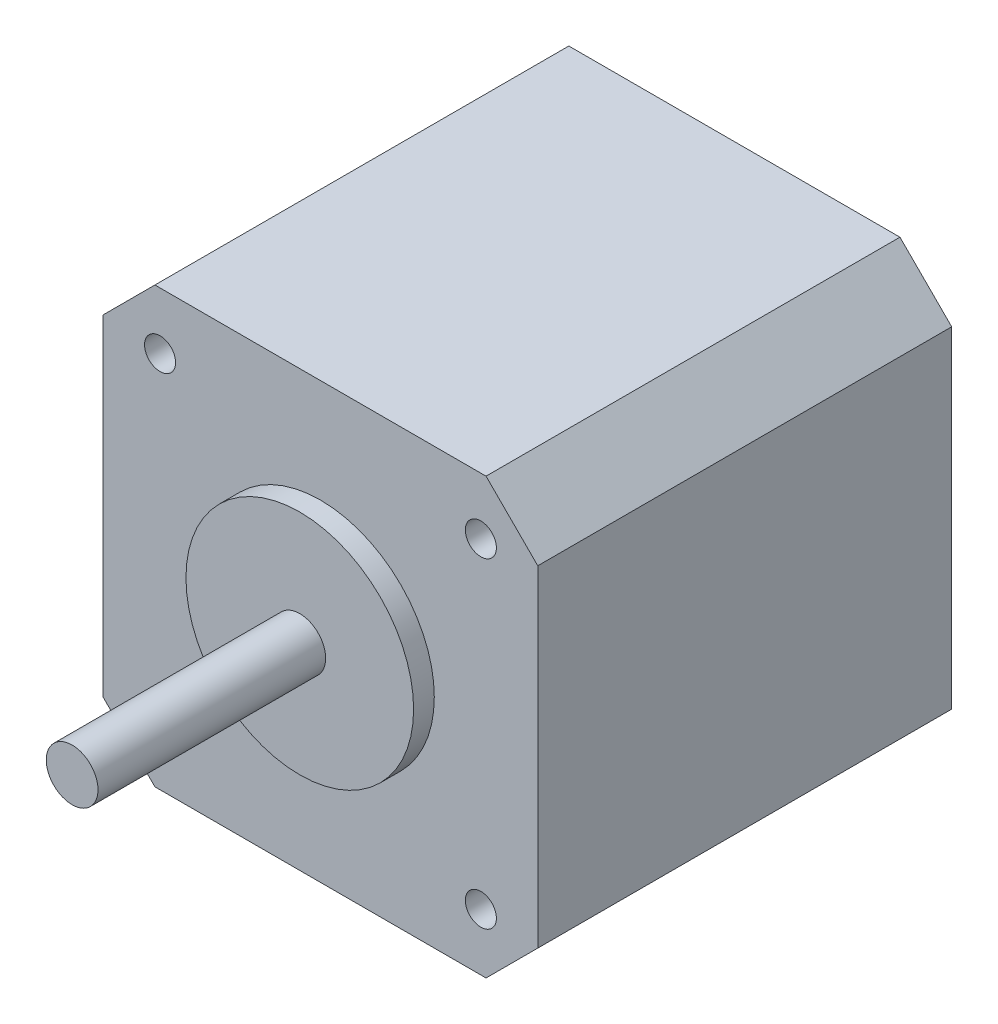
ISO-10303-21;
HEADER;
FILE_DESCRIPTION(('STEP AP214'),'2;1');
FILE_NAME('part.step','',(''),(''),'','','');
FILE_SCHEMA(('AUTOMOTIVE_DESIGN { 1 0 10303 214 1 1 1 1 }'));
ENDSEC;
DATA;
#1=APPLICATION_CONTEXT('core data for automotive mechanical design processes');
#2=APPLICATION_PROTOCOL_DEFINITION('international standard','automotive_design',2000,#1);
#3=PRODUCT_CONTEXT('',#1,'mechanical');
#4=PRODUCT('Part','Part','',(#3));
#5=PRODUCT_RELATED_PRODUCT_CATEGORY('part','',(#4));
#6=PRODUCT_DEFINITION_FORMATION('','',#4);
#7=PRODUCT_DEFINITION_CONTEXT('part definition',#1,'design');
#8=PRODUCT_DEFINITION('design','',#6,#7);
#9=PRODUCT_DEFINITION_SHAPE('','',#8);
#10=(LENGTH_UNIT() NAMED_UNIT(*) SI_UNIT(.MILLI.,.METRE.));
#11=(NAMED_UNIT(*) PLANE_ANGLE_UNIT() SI_UNIT($,.RADIAN.));
#12=(NAMED_UNIT(*) SI_UNIT($,.STERADIAN.) SOLID_ANGLE_UNIT());
#13=UNCERTAINTY_MEASURE_WITH_UNIT(LENGTH_MEASURE(1.E-05),#10,'distance_accuracy_value','');
#14=(GEOMETRIC_REPRESENTATION_CONTEXT(3) GLOBAL_UNCERTAINTY_ASSIGNED_CONTEXT((#13)) GLOBAL_UNIT_ASSIGNED_CONTEXT((#10,
#11,#12)) REPRESENTATION_CONTEXT('',''));
#15=CARTESIAN_POINT('',(0.,0.,0.));
#16=DIRECTION('',(0.,0.,1.));
#17=DIRECTION('',(1.,0.,0.));
#18=AXIS2_PLACEMENT_3D('',#15,#16,#17);
#19=CARTESIAN_POINT('',(21.,-21.,40.));
#20=DIRECTION('',(-1.,0.,0.));
#21=DIRECTION('',(0.,0.,1.));
#22=AXIS2_PLACEMENT_3D('',#19,#20,#21);
#23=PLANE('',#22);
#24=DIRECTION('',(0.,1.,0.));
#25=VECTOR('',#24,1.);
#26=CARTESIAN_POINT('',(21.,-21.,40.));
#27=LINE('',#26,#25);
#28=CARTESIAN_POINT('',(21.,-16.,40.));
#29=VERTEX_POINT('',#28);
#30=CARTESIAN_POINT('',(21.,16.,40.));
#31=VERTEX_POINT('',#30);
#32=EDGE_CURVE('E124',#29,#31,#27,.T.);
#33=ORIENTED_EDGE('',*,*,#32,.F.);
#34=DIRECTION('',(0.,0.,-1.));
#35=VECTOR('',#34,1.);
#36=CARTESIAN_POINT('',(21.,-16.,40.));
#37=LINE('',#36,#35);
#38=CARTESIAN_POINT('',(21.,-16.,0.));
#39=VERTEX_POINT('',#38);
#40=EDGE_CURVE('E109',#29,#39,#37,.T.);
#41=ORIENTED_EDGE('',*,*,#40,.T.);
#42=DIRECTION('',(0.,1.,0.));
#43=VECTOR('',#42,1.);
#44=CARTESIAN_POINT('',(21.,-21.,0.));
#45=LINE('',#44,#43);
#46=CARTESIAN_POINT('',(21.,16.,0.));
#47=VERTEX_POINT('',#46);
#48=EDGE_CURVE('E121',#39,#47,#45,.T.);
#49=ORIENTED_EDGE('',*,*,#48,.T.);
#50=DIRECTION('',(0.,0.,1.));
#51=VECTOR('',#50,1.);
#52=CARTESIAN_POINT('',(21.,16.,40.));
#53=LINE('',#52,#51);
#54=EDGE_CURVE('E126',#47,#31,#53,.T.);
#55=ORIENTED_EDGE('',*,*,#54,.T.);
#56=EDGE_LOOP('',(#33,#41,#49,#55));
#57=FACE_BOUND('',#56,.T.);
#58=ADVANCED_FACE('F37',(#57),#23,.F.);
#59=CARTESIAN_POINT('',(-21.,21.,40.));
#60=DIRECTION('',(0.,-1.,0.));
#61=DIRECTION('',(0.,0.,-1.));
#62=AXIS2_PLACEMENT_3D('',#59,#60,#61);
#63=PLANE('',#62);
#64=DIRECTION('',(-1.,0.,0.));
#65=VECTOR('',#64,1.);
#66=CARTESIAN_POINT('',(-21.,21.,40.));
#67=LINE('',#66,#65);
#68=CARTESIAN_POINT('',(16.,21.,40.));
#69=VERTEX_POINT('',#68);
#70=CARTESIAN_POINT('',(-16.,21.,40.));
#71=VERTEX_POINT('',#70);
#72=EDGE_CURVE('E169',#69,#71,#67,.T.);
#73=ORIENTED_EDGE('',*,*,#72,.F.);
#74=DIRECTION('',(0.,0.,-1.));
#75=VECTOR('',#74,1.);
#76=CARTESIAN_POINT('',(16.,21.,40.));
#77=LINE('',#76,#75);
#78=CARTESIAN_POINT('',(16.,21.,0.));
#79=VERTEX_POINT('',#78);
#80=EDGE_CURVE('E11',#69,#79,#77,.T.);
#81=ORIENTED_EDGE('',*,*,#80,.T.);
#82=DIRECTION('',(-1.,0.,0.));
#83=VECTOR('',#82,1.);
#84=CARTESIAN_POINT('',(-21.,21.,0.));
#85=LINE('',#84,#83);
#86=CARTESIAN_POINT('',(-16.,21.,0.));
#87=VERTEX_POINT('',#86);
#88=EDGE_CURVE('E131',#79,#87,#85,.T.);
#89=ORIENTED_EDGE('',*,*,#88,.T.);
#90=DIRECTION('',(0.,0.,1.));
#91=VECTOR('',#90,1.);
#92=CARTESIAN_POINT('',(-16.,21.,40.));
#93=LINE('',#92,#91);
#94=EDGE_CURVE('E46',#87,#71,#93,.T.);
#95=ORIENTED_EDGE('',*,*,#94,.T.);
#96=EDGE_LOOP('',(#73,#81,#89,#95));
#97=FACE_BOUND('',#96,.T.);
#98=ADVANCED_FACE('F168',(#97),#63,.F.);
#99=CARTESIAN_POINT('',(-21.,-21.,40.));
#100=DIRECTION('',(1.,0.,0.));
#101=DIRECTION('',(0.,0.,-1.));
#102=AXIS2_PLACEMENT_3D('',#99,#100,#101);
#103=PLANE('',#102);
#104=DIRECTION('',(0.,-1.,0.));
#105=VECTOR('',#104,1.);
#106=CARTESIAN_POINT('',(-21.,-21.,0.));
#107=LINE('',#106,#105);
#108=CARTESIAN_POINT('',(-21.,16.,0.));
#109=VERTEX_POINT('',#108);
#110=CARTESIAN_POINT('',(-21.,-16.,0.));
#111=VERTEX_POINT('',#110);
#112=EDGE_CURVE('E135',#109,#111,#107,.T.);
#113=ORIENTED_EDGE('',*,*,#112,.T.);
#114=DIRECTION('',(0.,0.,1.));
#115=VECTOR('',#114,1.);
#116=CARTESIAN_POINT('',(-21.,-16.,40.));
#117=LINE('',#116,#115);
#118=CARTESIAN_POINT('',(-21.,-16.,40.));
#119=VERTEX_POINT('',#118);
#120=EDGE_CURVE('E53',#111,#119,#117,.T.);
#121=ORIENTED_EDGE('',*,*,#120,.T.);
#122=DIRECTION('',(0.,-1.,0.));
#123=VECTOR('',#122,1.);
#124=CARTESIAN_POINT('',(-21.,-21.,40.));
#125=LINE('',#124,#123);
#126=CARTESIAN_POINT('',(-21.,16.,40.));
#127=VERTEX_POINT('',#126);
#128=EDGE_CURVE('E175',#127,#119,#125,.T.);
#129=ORIENTED_EDGE('',*,*,#128,.F.);
#130=DIRECTION('',(0.,0.,-1.));
#131=VECTOR('',#130,1.);
#132=CARTESIAN_POINT('',(-21.,16.,40.));
#133=LINE('',#132,#131);
#134=EDGE_CURVE('E162',#127,#109,#133,.T.);
#135=ORIENTED_EDGE('',*,*,#134,.T.);
#136=EDGE_LOOP('',(#113,#121,#129,#135));
#137=FACE_BOUND('',#136,.T.);
#138=ADVANCED_FACE('F179',(#137),#103,.F.);
#139=CARTESIAN_POINT('',(-21.,-21.,40.));
#140=DIRECTION('',(0.,1.,0.));
#141=DIRECTION('',(0.,0.,1.));
#142=AXIS2_PLACEMENT_3D('',#139,#140,#141);
#143=PLANE('',#142);
#144=DIRECTION('',(1.,0.,0.));
#145=VECTOR('',#144,1.);
#146=CARTESIAN_POINT('',(-21.,-21.,0.));
#147=LINE('',#146,#145);
#148=CARTESIAN_POINT('',(-16.,-21.,0.));
#149=VERTEX_POINT('',#148);
#150=CARTESIAN_POINT('',(16.,-21.,0.));
#151=VERTEX_POINT('',#150);
#152=EDGE_CURVE('E145',#149,#151,#147,.T.);
#153=ORIENTED_EDGE('',*,*,#152,.T.);
#154=DIRECTION('',(0.,0.,1.));
#155=VECTOR('',#154,1.);
#156=CARTESIAN_POINT('',(16.,-21.,40.));
#157=LINE('',#156,#155);
#158=CARTESIAN_POINT('',(16.,-21.,40.));
#159=VERTEX_POINT('',#158);
#160=EDGE_CURVE('E110',#151,#159,#157,.T.);
#161=ORIENTED_EDGE('',*,*,#160,.T.);
#162=DIRECTION('',(1.,0.,0.));
#163=VECTOR('',#162,1.);
#164=CARTESIAN_POINT('',(-21.,-21.,40.));
#165=LINE('',#164,#163);
#166=CARTESIAN_POINT('',(-16.,-21.,40.));
#167=VERTEX_POINT('',#166);
#168=EDGE_CURVE('E141',#167,#159,#165,.T.);
#169=ORIENTED_EDGE('',*,*,#168,.F.);
#170=DIRECTION('',(0.,0.,-1.));
#171=VECTOR('',#170,1.);
#172=CARTESIAN_POINT('',(-16.,-21.,40.));
#173=LINE('',#172,#171);
#174=EDGE_CURVE('E115',#167,#149,#173,.T.);
#175=ORIENTED_EDGE('',*,*,#174,.T.);
#176=EDGE_LOOP('',(#153,#161,#169,#175));
#177=FACE_BOUND('',#176,.T.);
#178=ADVANCED_FACE('F186',(#177),#143,.F.);
#179=CARTESIAN_POINT('',(0.,0.,40.));
#180=DIRECTION('',(0.,0.,-1.));
#181=DIRECTION('',(-1.,0.,0.));
#182=AXIS2_PLACEMENT_3D('',#179,#180,#181);
#183=PLANE('',#182);
#184=CARTESIAN_POINT('',(-15.5,-15.5,40.));
#185=DIRECTION('',(0.,0.,1.));
#186=DIRECTION('',(1.,0.,0.));
#187=AXIS2_PLACEMENT_3D('',#184,#185,#186);
#188=CIRCLE('',#187,1.5);
#189=CARTESIAN_POINT('',(-14.,-15.5,40.));
#190=VERTEX_POINT('',#189);
#191=EDGE_CURVE('E203',#190,#190,#188,.T.);
#192=ORIENTED_EDGE('',*,*,#191,.F.);
#193=EDGE_LOOP('',(#192));
#194=FACE_BOUND('',#193,.T.);
#195=CARTESIAN_POINT('',(15.5,-15.5,40.));
#196=DIRECTION('',(0.,0.,1.));
#197=DIRECTION('',(1.,0.,0.));
#198=AXIS2_PLACEMENT_3D('',#195,#196,#197);
#199=CIRCLE('',#198,1.5);
#200=CARTESIAN_POINT('',(17.,-15.5,40.));
#201=VERTEX_POINT('',#200);
#202=EDGE_CURVE('E209',#201,#201,#199,.T.);
#203=ORIENTED_EDGE('',*,*,#202,.F.);
#204=EDGE_LOOP('',(#203));
#205=FACE_BOUND('',#204,.T.);
#206=CARTESIAN_POINT('',(15.5,15.5,40.));
#207=DIRECTION('',(0.,0.,1.));
#208=DIRECTION('',(1.,0.,0.));
#209=AXIS2_PLACEMENT_3D('',#206,#207,#208);
#210=CIRCLE('',#209,1.5);
#211=CARTESIAN_POINT('',(17.,15.5,40.));
#212=VERTEX_POINT('',#211);
#213=EDGE_CURVE('E215',#212,#212,#210,.T.);
#214=ORIENTED_EDGE('',*,*,#213,.F.);
#215=EDGE_LOOP('',(#214));
#216=FACE_BOUND('',#215,.T.);
#217=CARTESIAN_POINT('',(-15.5,15.5,40.));
#218=DIRECTION('',(0.,0.,1.));
#219=DIRECTION('',(1.,0.,0.));
#220=AXIS2_PLACEMENT_3D('',#217,#218,#219);
#221=CIRCLE('',#220,1.5);
#222=CARTESIAN_POINT('',(-14.,15.5,40.));
#223=VERTEX_POINT('',#222);
#224=EDGE_CURVE('E197',#223,#223,#221,.T.);
#225=ORIENTED_EDGE('',*,*,#224,.F.);
#226=EDGE_LOOP('',(#225));
#227=FACE_BOUND('',#226,.T.);
#228=CARTESIAN_POINT('',(0.,0.,40.));
#229=DIRECTION('',(0.,0.,1.));
#230=DIRECTION('',(1.,0.,0.));
#231=AXIS2_PLACEMENT_3D('',#228,#229,#230);
#232=CIRCLE('',#231,11.);
#233=CARTESIAN_POINT('',(11.,0.,40.));
#234=VERTEX_POINT('',#233);
#235=EDGE_CURVE('E187',#234,#234,#232,.T.);
#236=ORIENTED_EDGE('',*,*,#235,.F.);
#237=EDGE_LOOP('',(#236));
#238=FACE_BOUND('',#237,.T.);
#239=ORIENTED_EDGE('',*,*,#168,.T.);
#240=DIRECTION('',(-0.707106781186548,-0.707106781186547,0.));
#241=VECTOR('',#240,1.);
#242=CARTESIAN_POINT('',(21.,-16.,40.));
#243=LINE('',#242,#241);
#244=EDGE_CURVE('E160',#159,#29,#243,.F.);
#245=ORIENTED_EDGE('',*,*,#244,.T.);
#246=ORIENTED_EDGE('',*,*,#32,.T.);
#247=DIRECTION('',(0.707106781186547,-0.707106781186548,0.));
#248=VECTOR('',#247,1.);
#249=CARTESIAN_POINT('',(16.,21.,40.));
#250=LINE('',#249,#248);
#251=EDGE_CURVE('E156',#31,#69,#250,.F.);
#252=ORIENTED_EDGE('',*,*,#251,.T.);
#253=ORIENTED_EDGE('',*,*,#72,.T.);
#254=DIRECTION('',(0.707106781186548,0.707106781186547,0.));
#255=VECTOR('',#254,1.);
#256=CARTESIAN_POINT('',(-21.,16.,40.));
#257=LINE('',#256,#255);
#258=EDGE_CURVE('E60',#71,#127,#257,.F.);
#259=ORIENTED_EDGE('',*,*,#258,.T.);
#260=ORIENTED_EDGE('',*,*,#128,.T.);
#261=DIRECTION('',(-0.707106781186547,0.707106781186548,0.));
#262=VECTOR('',#261,1.);
#263=CARTESIAN_POINT('',(-16.,-21.,40.));
#264=LINE('',#263,#262);
#265=EDGE_CURVE('E158',#119,#167,#264,.F.);
#266=ORIENTED_EDGE('',*,*,#265,.T.);
#267=EDGE_LOOP('',(#239,#245,#246,#252,#253,#259,#260,#266));
#268=FACE_BOUND('',#267,.T.);
#269=ADVANCED_FACE('F173',(#194,#205,#216,#227,#238,#268),#183,.F.);
#270=CARTESIAN_POINT('',(0.,0.,0.));
#271=DIRECTION('',(0.,0.,-1.));
#272=DIRECTION('',(-1.,0.,0.));
#273=AXIS2_PLACEMENT_3D('',#270,#271,#272);
#274=PLANE('',#273);
#275=ORIENTED_EDGE('',*,*,#48,.F.);
#276=DIRECTION('',(0.707106781186548,0.707106781186547,0.));
#277=VECTOR('',#276,1.);
#278=CARTESIAN_POINT('',(18.5,-18.5,0.));
#279=LINE('',#278,#277);
#280=EDGE_CURVE('E105',#39,#151,#279,.F.);
#281=ORIENTED_EDGE('',*,*,#280,.T.);
#282=ORIENTED_EDGE('',*,*,#152,.F.);
#283=DIRECTION('',(0.707106781186547,-0.707106781186548,0.));
#284=VECTOR('',#283,1.);
#285=CARTESIAN_POINT('',(-18.5,-18.5,0.));
#286=LINE('',#285,#284);
#287=EDGE_CURVE('E116',#149,#111,#286,.F.);
#288=ORIENTED_EDGE('',*,*,#287,.T.);
#289=ORIENTED_EDGE('',*,*,#112,.F.);
#290=DIRECTION('',(-0.707106781186548,-0.707106781186547,0.));
#291=VECTOR('',#290,1.);
#292=CARTESIAN_POINT('',(-18.5,18.5,0.));
#293=LINE('',#292,#291);
#294=EDGE_CURVE('E125',#109,#87,#293,.F.);
#295=ORIENTED_EDGE('',*,*,#294,.T.);
#296=ORIENTED_EDGE('',*,*,#88,.F.);
#297=DIRECTION('',(-0.707106781186547,0.707106781186548,0.));
#298=VECTOR('',#297,1.);
#299=CARTESIAN_POINT('',(18.5,18.5,0.));
#300=LINE('',#299,#298);
#301=EDGE_CURVE('E130',#79,#47,#300,.F.);
#302=ORIENTED_EDGE('',*,*,#301,.T.);
#303=EDGE_LOOP('',(#275,#281,#282,#288,#289,#295,#296,#302));
#304=FACE_BOUND('',#303,.T.);
#305=ADVANCED_FACE('F128',(#304),#274,.T.);
#306=CARTESIAN_POINT('',(0.,0.,42.));
#307=DIRECTION('',(0.,0.,-1.));
#308=DIRECTION('',(-1.,0.,0.));
#309=AXIS2_PLACEMENT_3D('',#306,#307,#308);
#310=CYLINDRICAL_SURFACE('',#309,11.);
#311=CARTESIAN_POINT('',(0.,0.,42.));
#312=DIRECTION('',(0.,0.,1.));
#313=DIRECTION('',(1.,0.,0.));
#314=AXIS2_PLACEMENT_3D('',#311,#312,#313);
#315=CIRCLE('',#314,11.);
#316=CARTESIAN_POINT('',(11.,0.,42.));
#317=VERTEX_POINT('',#316);
#318=EDGE_CURVE('E132',#317,#317,#315,.T.);
#319=ORIENTED_EDGE('',*,*,#318,.F.);
#320=EDGE_LOOP('',(#319));
#321=FACE_BOUND('',#320,.T.);
#322=ORIENTED_EDGE('',*,*,#235,.T.);
#323=EDGE_LOOP('',(#322));
#324=FACE_BOUND('',#323,.T.);
#325=ADVANCED_FACE('F238',(#321,#324),#310,.T.);
#326=CARTESIAN_POINT('',(0.,0.,42.));
#327=DIRECTION('',(0.,0.,1.));
#328=DIRECTION('',(1.,0.,0.));
#329=AXIS2_PLACEMENT_3D('',#326,#327,#328);
#330=PLANE('',#329);
#331=CARTESIAN_POINT('',(0.,0.,42.));
#332=DIRECTION('',(0.,0.,1.));
#333=DIRECTION('',(1.,0.,0.));
#334=AXIS2_PLACEMENT_3D('',#331,#332,#333);
#335=CIRCLE('',#334,2.5);
#336=CARTESIAN_POINT('',(2.5,0.,42.));
#337=VERTEX_POINT('',#336);
#338=EDGE_CURVE('E147',#337,#337,#335,.T.);
#339=ORIENTED_EDGE('',*,*,#338,.F.);
#340=EDGE_LOOP('',(#339));
#341=FACE_BOUND('',#340,.T.);
#342=ORIENTED_EDGE('',*,*,#318,.T.);
#343=EDGE_LOOP('',(#342));
#344=FACE_BOUND('',#343,.T.);
#345=ADVANCED_FACE('F240',(#341,#344),#330,.T.);
#346=CARTESIAN_POINT('',(0.,0.,64.));
#347=DIRECTION('',(0.,0.,-1.));
#348=DIRECTION('',(-1.,0.,0.));
#349=AXIS2_PLACEMENT_3D('',#346,#347,#348);
#350=CYLINDRICAL_SURFACE('',#349,2.5);
#351=CARTESIAN_POINT('',(0.,0.,64.));
#352=DIRECTION('',(0.,0.,1.));
#353=DIRECTION('',(1.,0.,0.));
#354=AXIS2_PLACEMENT_3D('',#351,#352,#353);
#355=CIRCLE('',#354,2.5);
#356=CARTESIAN_POINT('',(2.5,0.,64.));
#357=VERTEX_POINT('',#356);
#358=EDGE_CURVE('E138',#357,#357,#355,.T.);
#359=ORIENTED_EDGE('',*,*,#358,.F.);
#360=EDGE_LOOP('',(#359));
#361=FACE_BOUND('',#360,.T.);
#362=ORIENTED_EDGE('',*,*,#338,.T.);
#363=EDGE_LOOP('',(#362));
#364=FACE_BOUND('',#363,.T.);
#365=ADVANCED_FACE('F247',(#361,#364),#350,.T.);
#366=CARTESIAN_POINT('',(0.,0.,64.));
#367=DIRECTION('',(0.,0.,1.));
#368=DIRECTION('',(1.,0.,0.));
#369=AXIS2_PLACEMENT_3D('',#366,#367,#368);
#370=PLANE('',#369);
#371=ORIENTED_EDGE('',*,*,#358,.T.);
#372=EDGE_LOOP('',(#371));
#373=FACE_BOUND('',#372,.T.);
#374=ADVANCED_FACE('F407',(#373),#370,.T.);
#375=CARTESIAN_POINT('',(-15.5,15.5,8.5));
#376=DIRECTION('',(0.,0.,1.));
#377=DIRECTION('',(1.,0.,0.));
#378=AXIS2_PLACEMENT_3D('',#375,#376,#377);
#379=CYLINDRICAL_SURFACE('',#378,1.5);
#380=CARTESIAN_POINT('',(-15.5,15.5,8.5));
#381=DIRECTION('',(0.,0.,1.));
#382=DIRECTION('',(1.,0.,0.));
#383=AXIS2_PLACEMENT_3D('',#380,#381,#382);
#384=CIRCLE('',#383,1.5);
#385=CARTESIAN_POINT('',(-14.,15.5,8.5));
#386=VERTEX_POINT('',#385);
#387=EDGE_CURVE('E196',#386,#386,#384,.T.);
#388=ORIENTED_EDGE('',*,*,#387,.F.);
#389=EDGE_LOOP('',(#388));
#390=FACE_BOUND('',#389,.T.);
#391=ORIENTED_EDGE('',*,*,#224,.T.);
#392=EDGE_LOOP('',(#391));
#393=FACE_BOUND('',#392,.T.);
#394=ADVANCED_FACE('F397',(#390,#393),#379,.F.);
#395=CARTESIAN_POINT('',(-15.5,15.5,8.5));
#396=DIRECTION('',(0.,0.,1.));
#397=DIRECTION('',(1.,0.,0.));
#398=AXIS2_PLACEMENT_3D('',#395,#396,#397);
#399=PLANE('',#398);
#400=ORIENTED_EDGE('',*,*,#387,.T.);
#401=EDGE_LOOP('',(#400));
#402=FACE_BOUND('',#401,.T.);
#403=ADVANCED_FACE('F226',(#402),#399,.T.);
#404=CARTESIAN_POINT('',(15.5,15.5,8.5));
#405=DIRECTION('',(0.,0.,1.));
#406=DIRECTION('',(1.,0.,0.));
#407=AXIS2_PLACEMENT_3D('',#404,#405,#406);
#408=CYLINDRICAL_SURFACE('',#407,1.5);
#409=CARTESIAN_POINT('',(15.5,15.5,8.5));
#410=DIRECTION('',(0.,0.,1.));
#411=DIRECTION('',(1.,0.,0.));
#412=AXIS2_PLACEMENT_3D('',#409,#410,#411);
#413=CIRCLE('',#412,1.5);
#414=CARTESIAN_POINT('',(17.,15.5,8.5));
#415=VERTEX_POINT('',#414);
#416=EDGE_CURVE('E200',#415,#415,#413,.T.);
#417=ORIENTED_EDGE('',*,*,#416,.F.);
#418=EDGE_LOOP('',(#417));
#419=FACE_BOUND('',#418,.T.);
#420=ORIENTED_EDGE('',*,*,#213,.T.);
#421=EDGE_LOOP('',(#420));
#422=FACE_BOUND('',#421,.T.);
#423=ADVANCED_FACE('F223',(#419,#422),#408,.F.);
#424=CARTESIAN_POINT('',(15.5,15.5,8.5));
#425=DIRECTION('',(0.,0.,1.));
#426=DIRECTION('',(1.,0.,0.));
#427=AXIS2_PLACEMENT_3D('',#424,#425,#426);
#428=PLANE('',#427);
#429=ORIENTED_EDGE('',*,*,#416,.T.);
#430=EDGE_LOOP('',(#429));
#431=FACE_BOUND('',#430,.T.);
#432=ADVANCED_FACE('F221',(#431),#428,.T.);
#433=CARTESIAN_POINT('',(15.5,-15.5,8.5));
#434=DIRECTION('',(0.,0.,1.));
#435=DIRECTION('',(1.,0.,0.));
#436=AXIS2_PLACEMENT_3D('',#433,#434,#435);
#437=CYLINDRICAL_SURFACE('',#436,1.5);
#438=CARTESIAN_POINT('',(15.5,-15.5,8.5));
#439=DIRECTION('',(0.,0.,1.));
#440=DIRECTION('',(1.,0.,0.));
#441=AXIS2_PLACEMENT_3D('',#438,#439,#440);
#442=CIRCLE('',#441,1.5);
#443=CARTESIAN_POINT('',(17.,-15.5,8.5));
#444=VERTEX_POINT('',#443);
#445=EDGE_CURVE('E212',#444,#444,#442,.T.);
#446=ORIENTED_EDGE('',*,*,#445,.F.);
#447=EDGE_LOOP('',(#446));
#448=FACE_BOUND('',#447,.T.);
#449=ORIENTED_EDGE('',*,*,#202,.T.);
#450=EDGE_LOOP('',(#449));
#451=FACE_BOUND('',#450,.T.);
#452=ADVANCED_FACE('F364',(#448,#451),#437,.F.);
#453=CARTESIAN_POINT('',(15.5,-15.5,8.5));
#454=DIRECTION('',(0.,0.,1.));
#455=DIRECTION('',(1.,0.,0.));
#456=AXIS2_PLACEMENT_3D('',#453,#454,#455);
#457=PLANE('',#456);
#458=ORIENTED_EDGE('',*,*,#445,.T.);
#459=EDGE_LOOP('',(#458));
#460=FACE_BOUND('',#459,.T.);
#461=ADVANCED_FACE('F354',(#460),#457,.T.);
#462=CARTESIAN_POINT('',(-15.5,-15.5,8.5));
#463=DIRECTION('',(0.,0.,1.));
#464=DIRECTION('',(1.,0.,0.));
#465=AXIS2_PLACEMENT_3D('',#462,#463,#464);
#466=CYLINDRICAL_SURFACE('',#465,1.5);
#467=CARTESIAN_POINT('',(-15.5,-15.5,8.5));
#468=DIRECTION('',(0.,0.,1.));
#469=DIRECTION('',(1.,0.,0.));
#470=AXIS2_PLACEMENT_3D('',#467,#468,#469);
#471=CIRCLE('',#470,1.5);
#472=CARTESIAN_POINT('',(-14.,-15.5,8.5));
#473=VERTEX_POINT('',#472);
#474=EDGE_CURVE('E206',#473,#473,#471,.T.);
#475=ORIENTED_EDGE('',*,*,#474,.F.);
#476=EDGE_LOOP('',(#475));
#477=FACE_BOUND('',#476,.T.);
#478=ORIENTED_EDGE('',*,*,#191,.T.);
#479=EDGE_LOOP('',(#478));
#480=FACE_BOUND('',#479,.T.);
#481=ADVANCED_FACE('F344',(#477,#480),#466,.F.);
#482=CARTESIAN_POINT('',(-15.5,-15.5,8.5));
#483=DIRECTION('',(0.,0.,1.));
#484=DIRECTION('',(1.,0.,0.));
#485=AXIS2_PLACEMENT_3D('',#482,#483,#484);
#486=PLANE('',#485);
#487=ORIENTED_EDGE('',*,*,#474,.T.);
#488=EDGE_LOOP('',(#487));
#489=FACE_BOUND('',#488,.T.);
#490=ADVANCED_FACE('F266',(#489),#486,.T.);
#491=CARTESIAN_POINT('',(21.,-16.,40.));
#492=DIRECTION('',(-0.707106781186547,0.707106781186548,0.));
#493=DIRECTION('',(0.,0.,-1.));
#494=AXIS2_PLACEMENT_3D('',#491,#492,#493);
#495=PLANE('',#494);
#496=ORIENTED_EDGE('',*,*,#244,.F.);
#497=ORIENTED_EDGE('',*,*,#160,.F.);
#498=ORIENTED_EDGE('',*,*,#280,.F.);
#499=ORIENTED_EDGE('',*,*,#40,.F.);
#500=EDGE_LOOP('',(#496,#497,#498,#499));
#501=FACE_BOUND('',#500,.T.);
#502=ADVANCED_FACE('F108',(#501),#495,.F.);
#503=CARTESIAN_POINT('',(-16.,-21.,40.));
#504=DIRECTION('',(0.707106781186548,0.707106781186547,0.));
#505=DIRECTION('',(0.,0.,-1.));
#506=AXIS2_PLACEMENT_3D('',#503,#504,#505);
#507=PLANE('',#506);
#508=ORIENTED_EDGE('',*,*,#265,.F.);
#509=ORIENTED_EDGE('',*,*,#120,.F.);
#510=ORIENTED_EDGE('',*,*,#287,.F.);
#511=ORIENTED_EDGE('',*,*,#174,.F.);
#512=EDGE_LOOP('',(#508,#509,#510,#511));
#513=FACE_BOUND('',#512,.T.);
#514=ADVANCED_FACE('F183',(#513),#507,.F.);
#515=CARTESIAN_POINT('',(16.,21.,40.));
#516=DIRECTION('',(-0.707106781186548,-0.707106781186547,0.));
#517=DIRECTION('',(0.,0.,-1.));
#518=AXIS2_PLACEMENT_3D('',#515,#516,#517);
#519=PLANE('',#518);
#520=ORIENTED_EDGE('',*,*,#251,.F.);
#521=ORIENTED_EDGE('',*,*,#54,.F.);
#522=ORIENTED_EDGE('',*,*,#301,.F.);
#523=ORIENTED_EDGE('',*,*,#80,.F.);
#524=EDGE_LOOP('',(#520,#521,#522,#523));
#525=FACE_BOUND('',#524,.T.);
#526=ADVANCED_FACE('F271',(#525),#519,.F.);
#527=CARTESIAN_POINT('',(-21.,16.,40.));
#528=DIRECTION('',(0.707106781186547,-0.707106781186548,0.));
#529=DIRECTION('',(0.,0.,-1.));
#530=AXIS2_PLACEMENT_3D('',#527,#528,#529);
#531=PLANE('',#530);
#532=ORIENTED_EDGE('',*,*,#258,.F.);
#533=ORIENTED_EDGE('',*,*,#94,.F.);
#534=ORIENTED_EDGE('',*,*,#294,.F.);
#535=ORIENTED_EDGE('',*,*,#134,.F.);
#536=EDGE_LOOP('',(#532,#533,#534,#535));
#537=FACE_BOUND('',#536,.T.);
#538=ADVANCED_FACE('F40',(#537),#531,.F.);
#539=CLOSED_SHELL('',(#58,#98,#138,#178,#269,#305,#325,#345,#365,#374,#394,#403,#423,#432,#452,
#461,#481,#490,#502,#514,#526,#538));
#540=MANIFOLD_SOLID_BREP('B2',#539);
#541=ADVANCED_BREP_SHAPE_REPRESENTATION('',(#18,#540),#14);
#542=SHAPE_DEFINITION_REPRESENTATION(#9,#541);
ENDSEC;
END-ISO-10303-21;
